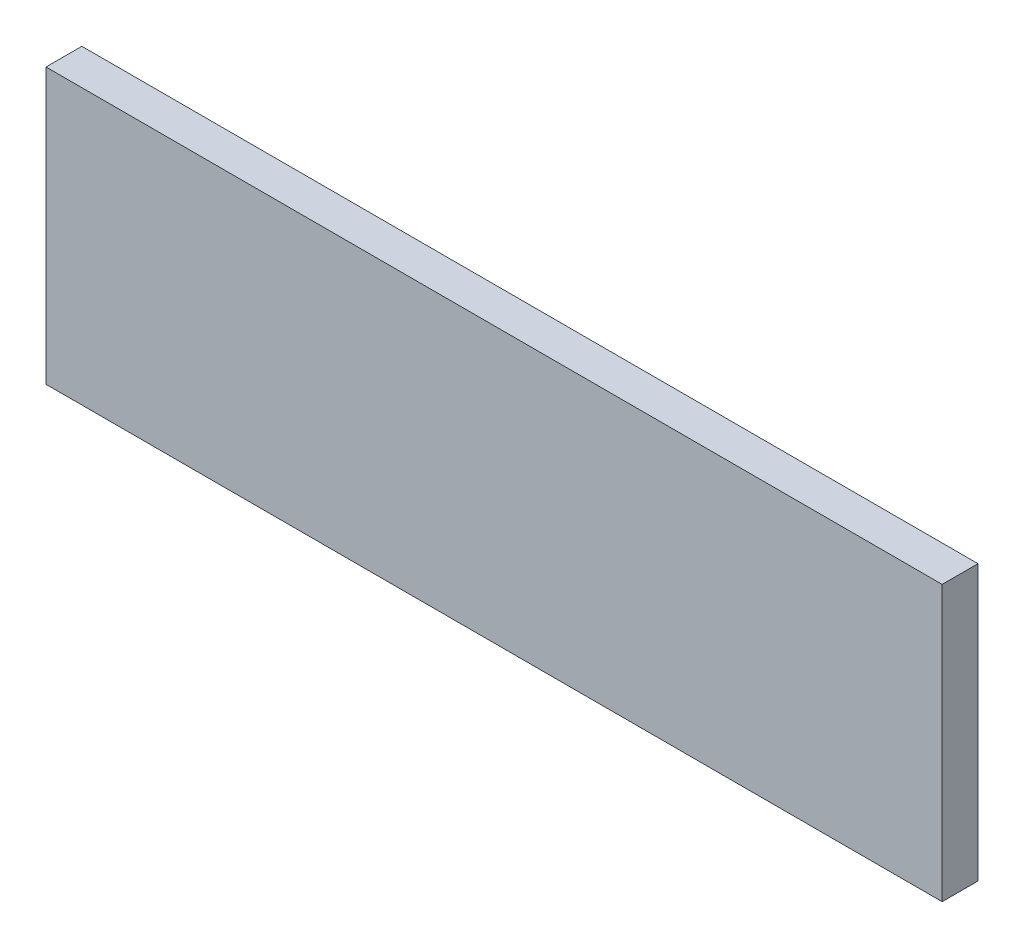
ISO-10303-21;
HEADER;
FILE_DESCRIPTION(('STEP AP214'),'2;1');
FILE_NAME('part.step','',(''),(''),'','','');
FILE_SCHEMA(('AUTOMOTIVE_DESIGN { 1 0 10303 214 1 1 1 1 }'));
ENDSEC;
DATA;
#1=APPLICATION_CONTEXT('core data for automotive mechanical design processes');
#2=APPLICATION_PROTOCOL_DEFINITION('international standard','automotive_design',2000,#1);
#3=PRODUCT_CONTEXT('',#1,'mechanical');
#4=PRODUCT('Part','Part','',(#3));
#5=PRODUCT_RELATED_PRODUCT_CATEGORY('part','',(#4));
#6=PRODUCT_DEFINITION_FORMATION('','',#4);
#7=PRODUCT_DEFINITION_CONTEXT('part definition',#1,'design');
#8=PRODUCT_DEFINITION('design','',#6,#7);
#9=PRODUCT_DEFINITION_SHAPE('','',#8);
#10=(LENGTH_UNIT() NAMED_UNIT(*) SI_UNIT(.MILLI.,.METRE.));
#11=(NAMED_UNIT(*) PLANE_ANGLE_UNIT() SI_UNIT($,.RADIAN.));
#12=(NAMED_UNIT(*) SI_UNIT($,.STERADIAN.) SOLID_ANGLE_UNIT());
#13=UNCERTAINTY_MEASURE_WITH_UNIT(LENGTH_MEASURE(1.E-05),#10,'distance_accuracy_value','');
#14=(GEOMETRIC_REPRESENTATION_CONTEXT(3) GLOBAL_UNCERTAINTY_ASSIGNED_CONTEXT((#13)) GLOBAL_UNIT_ASSIGNED_CONTEXT((#10,
#11,#12)) REPRESENTATION_CONTEXT('',''));
#15=CARTESIAN_POINT('',(0.,0.,0.));
#16=DIRECTION('',(0.,0.,1.));
#17=DIRECTION('',(1.,0.,0.));
#18=AXIS2_PLACEMENT_3D('',#15,#16,#17);
#19=CARTESIAN_POINT('',(75.,23.,6.));
#20=DIRECTION('',(-1.,0.,0.));
#21=DIRECTION('',(0.,0.,1.));
#22=AXIS2_PLACEMENT_3D('',#19,#20,#21);
#23=PLANE('',#22);
#24=DIRECTION('',(0.,1.,0.));
#25=VECTOR('',#24,1.);
#26=CARTESIAN_POINT('',(75.,23.,0.));
#27=LINE('',#26,#25);
#28=CARTESIAN_POINT('',(75.,-23.,0.));
#29=VERTEX_POINT('',#28);
#30=CARTESIAN_POINT('',(75.,23.,0.));
#31=VERTEX_POINT('',#30);
#32=EDGE_CURVE('E107',#29,#31,#27,.T.);
#33=ORIENTED_EDGE('',*,*,#32,.T.);
#34=DIRECTION('',(0.,0.,-1.));
#35=VECTOR('',#34,1.);
#36=CARTESIAN_POINT('',(75.,23.,6.));
#37=LINE('',#36,#35);
#38=CARTESIAN_POINT('',(75.,23.,6.));
#39=VERTEX_POINT('',#38);
#40=EDGE_CURVE('E11',#39,#31,#37,.T.);
#41=ORIENTED_EDGE('',*,*,#40,.F.);
#42=DIRECTION('',(0.,1.,0.));
#43=VECTOR('',#42,1.);
#44=CARTESIAN_POINT('',(75.,23.,6.));
#45=LINE('',#44,#43);
#46=CARTESIAN_POINT('',(75.,-23.,6.));
#47=VERTEX_POINT('',#46);
#48=EDGE_CURVE('E91',#47,#39,#45,.T.);
#49=ORIENTED_EDGE('',*,*,#48,.F.);
#50=DIRECTION('',(0.,0.,-1.));
#51=VECTOR('',#50,1.);
#52=CARTESIAN_POINT('',(75.,-23.,6.));
#53=LINE('',#52,#51);
#54=EDGE_CURVE('E103',#47,#29,#53,.T.);
#55=ORIENTED_EDGE('',*,*,#54,.T.);
#56=EDGE_LOOP('',(#33,#41,#49,#55));
#57=FACE_BOUND('',#56,.T.);
#58=ADVANCED_FACE('F39',(#57),#23,.F.);
#59=CARTESIAN_POINT('',(-75.,23.,6.));
#60=DIRECTION('',(0.,-1.,0.));
#61=DIRECTION('',(0.,0.,-1.));
#62=AXIS2_PLACEMENT_3D('',#59,#60,#61);
#63=PLANE('',#62);
#64=DIRECTION('',(-1.,0.,0.));
#65=VECTOR('',#64,1.);
#66=CARTESIAN_POINT('',(-75.,23.,0.));
#67=LINE('',#66,#65);
#68=CARTESIAN_POINT('',(-75.,23.,0.));
#69=VERTEX_POINT('',#68);
#70=EDGE_CURVE('E96',#31,#69,#67,.T.);
#71=ORIENTED_EDGE('',*,*,#70,.T.);
#72=DIRECTION('',(0.,0.,-1.));
#73=VECTOR('',#72,1.);
#74=CARTESIAN_POINT('',(-75.,23.,6.));
#75=LINE('',#74,#73);
#76=CARTESIAN_POINT('',(-75.,23.,6.));
#77=VERTEX_POINT('',#76);
#78=EDGE_CURVE('E48',#77,#69,#75,.T.);
#79=ORIENTED_EDGE('',*,*,#78,.F.);
#80=DIRECTION('',(-1.,0.,0.));
#81=VECTOR('',#80,1.);
#82=CARTESIAN_POINT('',(-75.,23.,6.));
#83=LINE('',#82,#81);
#84=EDGE_CURVE('E86',#39,#77,#83,.T.);
#85=ORIENTED_EDGE('',*,*,#84,.F.);
#86=ORIENTED_EDGE('',*,*,#40,.T.);
#87=EDGE_LOOP('',(#71,#79,#85,#86));
#88=FACE_BOUND('',#87,.T.);
#89=ADVANCED_FACE('F95',(#88),#63,.F.);
#90=CARTESIAN_POINT('',(-75.,23.,6.));
#91=DIRECTION('',(1.,0.,0.));
#92=DIRECTION('',(0.,0.,-1.));
#93=AXIS2_PLACEMENT_3D('',#90,#91,#92);
#94=PLANE('',#93);
#95=DIRECTION('',(0.,-1.,0.));
#96=VECTOR('',#95,1.);
#97=CARTESIAN_POINT('',(-75.,23.,0.));
#98=LINE('',#97,#96);
#99=CARTESIAN_POINT('',(-75.,-23.,0.));
#100=VERTEX_POINT('',#99);
#101=EDGE_CURVE('E73',#69,#100,#98,.T.);
#102=ORIENTED_EDGE('',*,*,#101,.T.);
#103=DIRECTION('',(0.,0.,-1.));
#104=VECTOR('',#103,1.);
#105=CARTESIAN_POINT('',(-75.,-23.,6.));
#106=LINE('',#105,#104);
#107=CARTESIAN_POINT('',(-75.,-23.,6.));
#108=VERTEX_POINT('',#107);
#109=EDGE_CURVE('E98',#108,#100,#106,.T.);
#110=ORIENTED_EDGE('',*,*,#109,.F.);
#111=DIRECTION('',(0.,-1.,0.));
#112=VECTOR('',#111,1.);
#113=CARTESIAN_POINT('',(-75.,23.,6.));
#114=LINE('',#113,#112);
#115=EDGE_CURVE('E89',#77,#108,#114,.T.);
#116=ORIENTED_EDGE('',*,*,#115,.F.);
#117=ORIENTED_EDGE('',*,*,#78,.T.);
#118=EDGE_LOOP('',(#102,#110,#116,#117));
#119=FACE_BOUND('',#118,.T.);
#120=ADVANCED_FACE('F99',(#119),#94,.F.);
#121=CARTESIAN_POINT('',(-75.,-23.,6.));
#122=DIRECTION('',(0.,1.,0.));
#123=DIRECTION('',(0.,0.,1.));
#124=AXIS2_PLACEMENT_3D('',#121,#122,#123);
#125=PLANE('',#124);
#126=DIRECTION('',(1.,0.,0.));
#127=VECTOR('',#126,1.);
#128=CARTESIAN_POINT('',(-75.,-23.,0.));
#129=LINE('',#128,#127);
#130=EDGE_CURVE('E79',#100,#29,#129,.T.);
#131=ORIENTED_EDGE('',*,*,#130,.T.);
#132=ORIENTED_EDGE('',*,*,#54,.F.);
#133=DIRECTION('',(1.,0.,0.));
#134=VECTOR('',#133,1.);
#135=CARTESIAN_POINT('',(-75.,-23.,6.));
#136=LINE('',#135,#134);
#137=EDGE_CURVE('E56',#108,#47,#136,.T.);
#138=ORIENTED_EDGE('',*,*,#137,.F.);
#139=ORIENTED_EDGE('',*,*,#109,.T.);
#140=EDGE_LOOP('',(#131,#132,#138,#139));
#141=FACE_BOUND('',#140,.T.);
#142=ADVANCED_FACE('F120',(#141),#125,.F.);
#143=CARTESIAN_POINT('',(0.,0.,6.));
#144=DIRECTION('',(0.,0.,1.));
#145=DIRECTION('',(1.,0.,0.));
#146=AXIS2_PLACEMENT_3D('',#143,#144,#145);
#147=PLANE('',#146);
#148=ORIENTED_EDGE('',*,*,#48,.T.);
#149=ORIENTED_EDGE('',*,*,#84,.T.);
#150=ORIENTED_EDGE('',*,*,#115,.T.);
#151=ORIENTED_EDGE('',*,*,#137,.T.);
#152=EDGE_LOOP('',(#148,#149,#150,#151));
#153=FACE_BOUND('',#152,.T.);
#154=ADVANCED_FACE('F87',(#153),#147,.T.);
#155=CARTESIAN_POINT('',(0.,0.,0.));
#156=DIRECTION('',(0.,0.,1.));
#157=DIRECTION('',(1.,0.,0.));
#158=AXIS2_PLACEMENT_3D('',#155,#156,#157);
#159=PLANE('',#158);
#160=ORIENTED_EDGE('',*,*,#32,.F.);
#161=ORIENTED_EDGE('',*,*,#130,.F.);
#162=ORIENTED_EDGE('',*,*,#101,.F.);
#163=ORIENTED_EDGE('',*,*,#70,.F.);
#164=EDGE_LOOP('',(#160,#161,#162,#163));
#165=FACE_BOUND('',#164,.T.);
#166=ADVANCED_FACE('F123',(#165),#159,.F.);
#167=CLOSED_SHELL('',(#58,#89,#120,#142,#154,#166));
#168=MANIFOLD_SOLID_BREP('B2',#167);
#169=ADVANCED_BREP_SHAPE_REPRESENTATION('',(#18,#168),#14);
#170=SHAPE_DEFINITION_REPRESENTATION(#9,#169);
ENDSEC;
END-ISO-10303-21;
